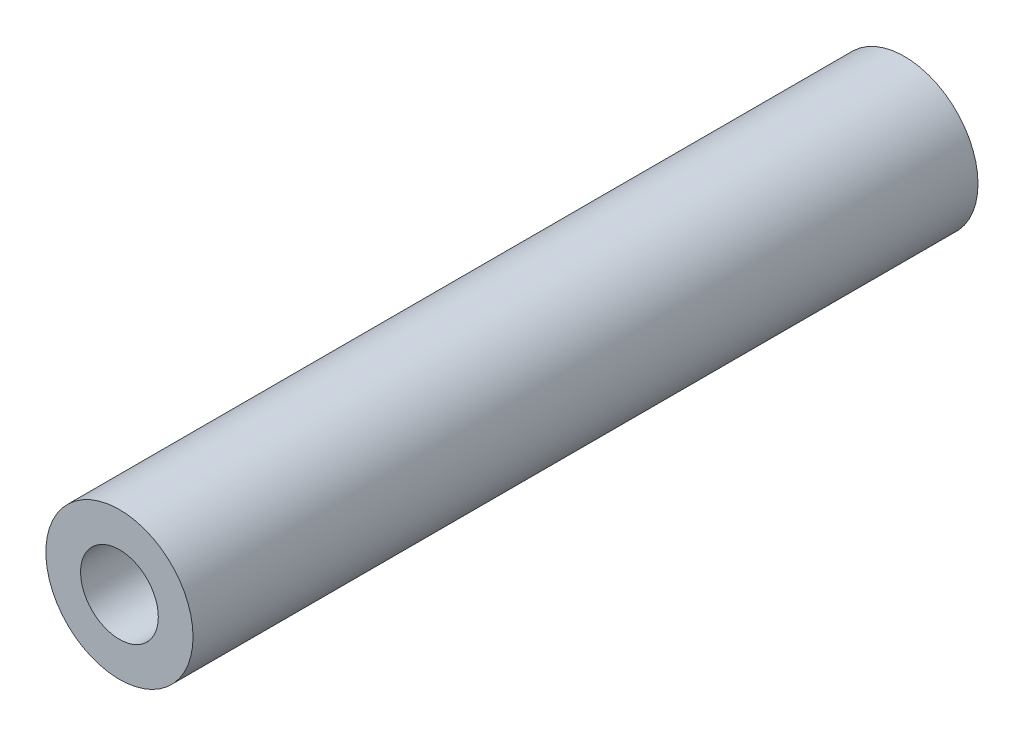
ISO-10303-21;
HEADER;
FILE_DESCRIPTION(('STEP AP214'),'2;1');
FILE_NAME('part.step','',(''),(''),'','','');
FILE_SCHEMA(('AUTOMOTIVE_DESIGN { 1 0 10303 214 1 1 1 1 }'));
ENDSEC;
DATA;
#1=APPLICATION_CONTEXT('core data for automotive mechanical design processes');
#2=APPLICATION_PROTOCOL_DEFINITION('international standard','automotive_design',2000,#1);
#3=PRODUCT_CONTEXT('',#1,'mechanical');
#4=PRODUCT('Part','Part','',(#3));
#5=PRODUCT_RELATED_PRODUCT_CATEGORY('part','',(#4));
#6=PRODUCT_DEFINITION_FORMATION('','',#4);
#7=PRODUCT_DEFINITION_CONTEXT('part definition',#1,'design');
#8=PRODUCT_DEFINITION('design','',#6,#7);
#9=PRODUCT_DEFINITION_SHAPE('','',#8);
#10=(LENGTH_UNIT() NAMED_UNIT(*) SI_UNIT(.MILLI.,.METRE.));
#11=(NAMED_UNIT(*) PLANE_ANGLE_UNIT() SI_UNIT($,.RADIAN.));
#12=(NAMED_UNIT(*) SI_UNIT($,.STERADIAN.) SOLID_ANGLE_UNIT());
#13=UNCERTAINTY_MEASURE_WITH_UNIT(LENGTH_MEASURE(1.E-05),#10,'distance_accuracy_value','');
#14=(GEOMETRIC_REPRESENTATION_CONTEXT(3) GLOBAL_UNCERTAINTY_ASSIGNED_CONTEXT((#13)) GLOBAL_UNIT_ASSIGNED_CONTEXT((#10,
#11,#12)) REPRESENTATION_CONTEXT('',''));
#15=CARTESIAN_POINT('',(0.,0.,0.));
#16=DIRECTION('',(0.,0.,1.));
#17=DIRECTION('',(1.,0.,0.));
#18=AXIS2_PLACEMENT_3D('',#15,#16,#17);
#19=CARTESIAN_POINT('',(-4.7625,33.3375,50.8));
#20=DIRECTION('',(0.,0.,1.));
#21=DIRECTION('',(1.,0.,0.));
#22=AXIS2_PLACEMENT_3D('',#19,#20,#21);
#23=PLANE('',#22);
#24=CARTESIAN_POINT('',(-4.7625,33.3375,50.8));
#25=DIRECTION('',(0.,0.,1.));
#26=DIRECTION('',(1.,0.,0.));
#27=AXIS2_PLACEMENT_3D('',#24,#25,#26);
#28=CIRCLE('',#27,4.7625);
#29=CARTESIAN_POINT('',(0.,33.3375,50.8));
#30=VERTEX_POINT('',#29);
#31=EDGE_CURVE('E10',#30,#30,#28,.T.);
#32=ORIENTED_EDGE('',*,*,#31,.T.);
#33=EDGE_LOOP('',(#32));
#34=FACE_BOUND('',#33,.T.);
#35=CARTESIAN_POINT('',(-4.7625,33.3375,50.8));
#36=DIRECTION('',(0.,0.,1.));
#37=DIRECTION('',(1.,0.,0.));
#38=AXIS2_PLACEMENT_3D('',#35,#36,#37);
#39=CIRCLE('',#38,2.5146);
#40=CARTESIAN_POINT('',(-2.2479,33.3375,50.8));
#41=VERTEX_POINT('',#40);
#42=EDGE_CURVE('E46',#41,#41,#39,.T.);
#43=ORIENTED_EDGE('',*,*,#42,.F.);
#44=EDGE_LOOP('',(#43));
#45=FACE_BOUND('',#44,.T.);
#46=ADVANCED_FACE('F35',(#34,#45),#23,.T.);
#47=CARTESIAN_POINT('',(-4.7625,33.3375,0.));
#48=DIRECTION('',(0.,0.,1.));
#49=DIRECTION('',(1.,0.,0.));
#50=AXIS2_PLACEMENT_3D('',#47,#48,#49);
#51=PLANE('',#50);
#52=CARTESIAN_POINT('',(-4.7625,33.3375,0.));
#53=DIRECTION('',(0.,0.,1.));
#54=DIRECTION('',(1.,0.,0.));
#55=AXIS2_PLACEMENT_3D('',#52,#53,#54);
#56=CIRCLE('',#55,4.7625);
#57=CARTESIAN_POINT('',(0.,33.3375,0.));
#58=VERTEX_POINT('',#57);
#59=EDGE_CURVE('E39',#58,#58,#56,.T.);
#60=ORIENTED_EDGE('',*,*,#59,.F.);
#61=EDGE_LOOP('',(#60));
#62=FACE_BOUND('',#61,.T.);
#63=CARTESIAN_POINT('',(-4.7625,33.3375,0.));
#64=DIRECTION('',(0.,0.,1.));
#65=DIRECTION('',(1.,0.,0.));
#66=AXIS2_PLACEMENT_3D('',#63,#64,#65);
#67=CIRCLE('',#66,2.5146);
#68=CARTESIAN_POINT('',(-2.2479,33.3375,0.));
#69=VERTEX_POINT('',#68);
#70=EDGE_CURVE('E48',#69,#69,#67,.T.);
#71=ORIENTED_EDGE('',*,*,#70,.T.);
#72=EDGE_LOOP('',(#71));
#73=FACE_BOUND('',#72,.T.);
#74=ADVANCED_FACE('F58',(#62,#73),#51,.F.);
#75=CARTESIAN_POINT('',(-4.7625,33.3375,50.8));
#76=DIRECTION('',(0.,0.,-1.));
#77=DIRECTION('',(-1.,0.,0.));
#78=AXIS2_PLACEMENT_3D('',#75,#76,#77);
#79=CYLINDRICAL_SURFACE('',#78,4.7625);
#80=ORIENTED_EDGE('',*,*,#31,.F.);
#81=EDGE_LOOP('',(#80));
#82=FACE_BOUND('',#81,.T.);
#83=ORIENTED_EDGE('',*,*,#59,.T.);
#84=EDGE_LOOP('',(#83));
#85=FACE_BOUND('',#84,.T.);
#86=ADVANCED_FACE('F37',(#82,#85),#79,.T.);
#87=CARTESIAN_POINT('',(-4.7625,33.3375,50.8));
#88=DIRECTION('',(0.,0.,-1.));
#89=DIRECTION('',(-1.,0.,0.));
#90=AXIS2_PLACEMENT_3D('',#87,#88,#89);
#91=CYLINDRICAL_SURFACE('',#90,2.5146);
#92=ORIENTED_EDGE('',*,*,#42,.T.);
#93=EDGE_LOOP('',(#92));
#94=FACE_BOUND('',#93,.T.);
#95=ORIENTED_EDGE('',*,*,#70,.F.);
#96=EDGE_LOOP('',(#95));
#97=FACE_BOUND('',#96,.T.);
#98=ADVANCED_FACE('F54',(#94,#97),#91,.F.);
#99=CLOSED_SHELL('',(#46,#74,#86,#98));
#100=MANIFOLD_SOLID_BREP('B2',#99);
#101=ADVANCED_BREP_SHAPE_REPRESENTATION('',(#18,#100),#14);
#102=SHAPE_DEFINITION_REPRESENTATION(#9,#101);
ENDSEC;
END-ISO-10303-21;
